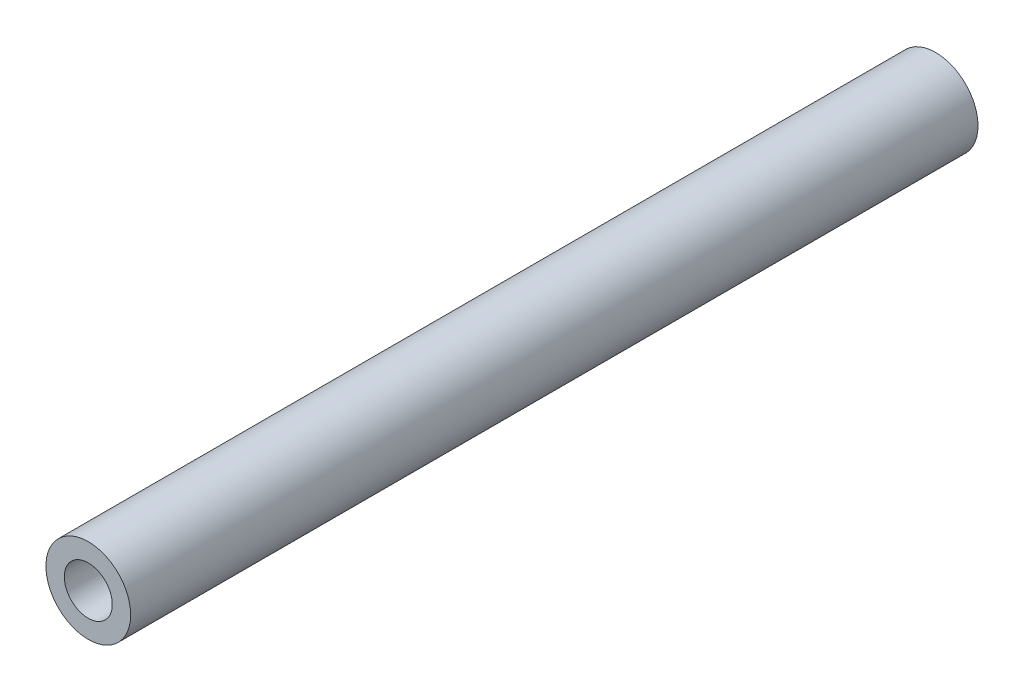
ISO-10303-21;
HEADER;
FILE_DESCRIPTION(('STEP AP214'),'2;1');
FILE_NAME('part.step','',(''),(''),'','','');
FILE_SCHEMA(('AUTOMOTIVE_DESIGN { 1 0 10303 214 1 1 1 1 }'));
ENDSEC;
DATA;
#1=APPLICATION_CONTEXT('core data for automotive mechanical design processes');
#2=APPLICATION_PROTOCOL_DEFINITION('international standard','automotive_design',2000,#1);
#3=PRODUCT_CONTEXT('',#1,'mechanical');
#4=PRODUCT('Part','Part','',(#3));
#5=PRODUCT_RELATED_PRODUCT_CATEGORY('part','',(#4));
#6=PRODUCT_DEFINITION_FORMATION('','',#4);
#7=PRODUCT_DEFINITION_CONTEXT('part definition',#1,'design');
#8=PRODUCT_DEFINITION('design','',#6,#7);
#9=PRODUCT_DEFINITION_SHAPE('','',#8);
#10=(LENGTH_UNIT() NAMED_UNIT(*) SI_UNIT(.MILLI.,.METRE.));
#11=(NAMED_UNIT(*) PLANE_ANGLE_UNIT() SI_UNIT($,.RADIAN.));
#12=(NAMED_UNIT(*) SI_UNIT($,.STERADIAN.) SOLID_ANGLE_UNIT());
#13=UNCERTAINTY_MEASURE_WITH_UNIT(LENGTH_MEASURE(1.E-05),#10,'distance_accuracy_value','');
#14=(GEOMETRIC_REPRESENTATION_CONTEXT(3) GLOBAL_UNCERTAINTY_ASSIGNED_CONTEXT((#13)) GLOBAL_UNIT_ASSIGNED_CONTEXT((#10,
#11,#12)) REPRESENTATION_CONTEXT('',''));
#15=CARTESIAN_POINT('',(0.,0.,0.));
#16=DIRECTION('',(0.,0.,1.));
#17=DIRECTION('',(1.,0.,0.));
#18=AXIS2_PLACEMENT_3D('',#15,#16,#17);
#19=CARTESIAN_POINT('',(0.,0.,0.));
#20=DIRECTION('',(0.,0.,1.));
#21=DIRECTION('',(1.,0.,0.));
#22=AXIS2_PLACEMENT_3D('',#19,#20,#21);
#23=PLANE('',#22);
#24=CARTESIAN_POINT('',(0.,0.,0.));
#25=DIRECTION('',(0.,0.,1.));
#26=DIRECTION('',(1.,0.,0.));
#27=AXIS2_PLACEMENT_3D('',#24,#25,#26);
#28=CIRCLE('',#27,3.);
#29=CARTESIAN_POINT('',(3.,0.,0.));
#30=VERTEX_POINT('',#29);
#31=EDGE_CURVE('E41',#30,#30,#28,.T.);
#32=ORIENTED_EDGE('',*,*,#31,.F.);
#33=EDGE_LOOP('',(#32));
#34=FACE_BOUND('',#33,.T.);
#35=CARTESIAN_POINT('',(0.,0.,0.));
#36=DIRECTION('',(0.,0.,-1.));
#37=DIRECTION('',(-1.,0.,0.));
#38=AXIS2_PLACEMENT_3D('',#35,#36,#37);
#39=CIRCLE('',#38,1.7);
#40=CARTESIAN_POINT('',(-1.7,0.,0.));
#41=VERTEX_POINT('',#40);
#42=EDGE_CURVE('E52',#41,#41,#39,.T.);
#43=ORIENTED_EDGE('',*,*,#42,.F.);
#44=EDGE_LOOP('',(#43));
#45=FACE_BOUND('',#44,.T.);
#46=ADVANCED_FACE('F37',(#34,#45),#23,.F.);
#47=CARTESIAN_POINT('',(0.,0.,60.));
#48=DIRECTION('',(0.,0.,-1.));
#49=DIRECTION('',(-1.,0.,0.));
#50=AXIS2_PLACEMENT_3D('',#47,#48,#49);
#51=CYLINDRICAL_SURFACE('',#50,3.);
#52=CARTESIAN_POINT('',(0.,0.,60.));
#53=DIRECTION('',(0.,0.,1.));
#54=DIRECTION('',(1.,0.,0.));
#55=AXIS2_PLACEMENT_3D('',#52,#53,#54);
#56=CIRCLE('',#55,3.);
#57=CARTESIAN_POINT('',(3.,0.,60.));
#58=VERTEX_POINT('',#57);
#59=EDGE_CURVE('E10',#58,#58,#56,.T.);
#60=ORIENTED_EDGE('',*,*,#59,.F.);
#61=EDGE_LOOP('',(#60));
#62=FACE_BOUND('',#61,.T.);
#63=ORIENTED_EDGE('',*,*,#31,.T.);
#64=EDGE_LOOP('',(#63));
#65=FACE_BOUND('',#64,.T.);
#66=ADVANCED_FACE('F39',(#62,#65),#51,.T.);
#67=CARTESIAN_POINT('',(0.,0.,60.));
#68=DIRECTION('',(0.,0.,1.));
#69=DIRECTION('',(1.,0.,0.));
#70=AXIS2_PLACEMENT_3D('',#67,#68,#69);
#71=PLANE('',#70);
#72=CARTESIAN_POINT('',(0.,0.,60.));
#73=DIRECTION('',(0.,0.,-1.));
#74=DIRECTION('',(-1.,0.,0.));
#75=AXIS2_PLACEMENT_3D('',#72,#73,#74);
#76=CIRCLE('',#75,1.69999999999999);
#77=CARTESIAN_POINT('',(-1.69999999999999,0.,60.));
#78=VERTEX_POINT('',#77);
#79=EDGE_CURVE('E48',#78,#78,#76,.T.);
#80=ORIENTED_EDGE('',*,*,#79,.T.);
#81=EDGE_LOOP('',(#80));
#82=FACE_BOUND('',#81,.T.);
#83=ORIENTED_EDGE('',*,*,#59,.T.);
#84=EDGE_LOOP('',(#83));
#85=FACE_BOUND('',#84,.T.);
#86=ADVANCED_FACE('F64',(#82,#85),#71,.T.);
#87=CARTESIAN_POINT('',(0.,0.,0.));
#88=DIRECTION('',(0.,0.,-1.));
#89=DIRECTION('',(-1.,0.,0.));
#90=AXIS2_PLACEMENT_3D('',#87,#88,#89);
#91=CYLINDRICAL_SURFACE('',#90,1.69999999999999);
#92=ORIENTED_EDGE('',*,*,#79,.F.);
#93=EDGE_LOOP('',(#92));
#94=FACE_BOUND('',#93,.T.);
#95=ORIENTED_EDGE('',*,*,#42,.T.);
#96=EDGE_LOOP('',(#95));
#97=FACE_BOUND('',#96,.T.);
#98=ADVANCED_FACE('F56',(#94,#97),#91,.F.);
#99=CLOSED_SHELL('',(#46,#66,#86,#98));
#100=MANIFOLD_SOLID_BREP('B2',#99);
#101=ADVANCED_BREP_SHAPE_REPRESENTATION('',(#18,#100),#14);
#102=SHAPE_DEFINITION_REPRESENTATION(#9,#101);
ENDSEC;
END-ISO-10303-21;
